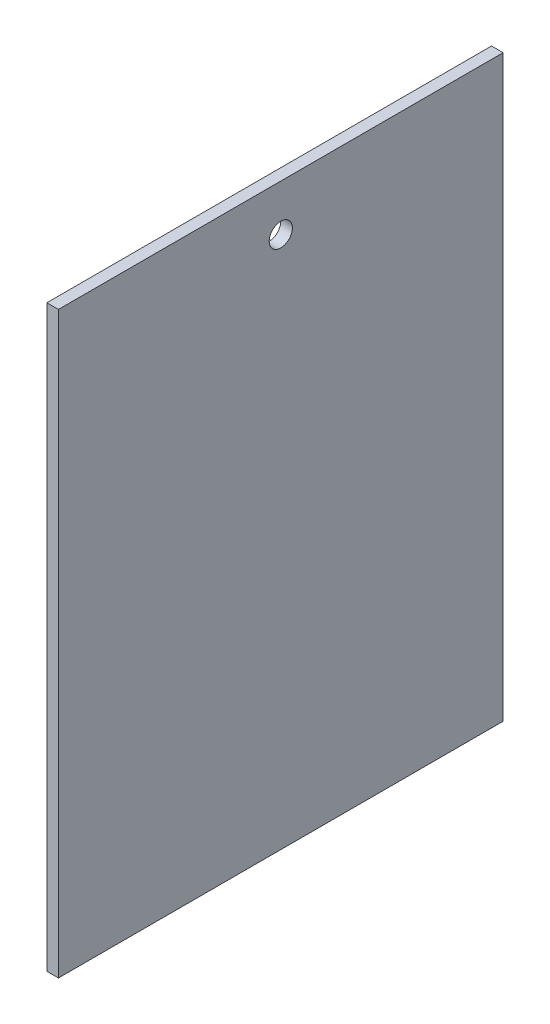
ISO-10303-21;
HEADER;
FILE_DESCRIPTION(('STEP AP214'),'2;1');
FILE_NAME('part.step','',(''),(''),'','','');
FILE_SCHEMA(('AUTOMOTIVE_DESIGN { 1 0 10303 214 1 1 1 1 }'));
ENDSEC;
DATA;
#1=APPLICATION_CONTEXT('core data for automotive mechanical design processes');
#2=APPLICATION_PROTOCOL_DEFINITION('international standard','automotive_design',2000,#1);
#3=PRODUCT_CONTEXT('',#1,'mechanical');
#4=PRODUCT('Part','Part','',(#3));
#5=PRODUCT_RELATED_PRODUCT_CATEGORY('part','',(#4));
#6=PRODUCT_DEFINITION_FORMATION('','',#4);
#7=PRODUCT_DEFINITION_CONTEXT('part definition',#1,'design');
#8=PRODUCT_DEFINITION('design','',#6,#7);
#9=PRODUCT_DEFINITION_SHAPE('','',#8);
#10=(LENGTH_UNIT() NAMED_UNIT(*) SI_UNIT(.MILLI.,.METRE.));
#11=(NAMED_UNIT(*) PLANE_ANGLE_UNIT() SI_UNIT($,.RADIAN.));
#12=(NAMED_UNIT(*) SI_UNIT($,.STERADIAN.) SOLID_ANGLE_UNIT());
#13=UNCERTAINTY_MEASURE_WITH_UNIT(LENGTH_MEASURE(1.E-05),#10,'distance_accuracy_value','');
#14=(GEOMETRIC_REPRESENTATION_CONTEXT(3) GLOBAL_UNCERTAINTY_ASSIGNED_CONTEXT((#13)) GLOBAL_UNIT_ASSIGNED_CONTEXT((#10,
#11,#12)) REPRESENTATION_CONTEXT('',''));
#15=CARTESIAN_POINT('',(0.,0.,0.));
#16=DIRECTION('',(0.,0.,1.));
#17=DIRECTION('',(1.,0.,0.));
#18=AXIS2_PLACEMENT_3D('',#15,#16,#17);
#19=CARTESIAN_POINT('',(5.,250.,-192.));
#20=DIRECTION('',(0.,0.,1.));
#21=DIRECTION('',(0.,-1.,0.));
#22=AXIS2_PLACEMENT_3D('',#19,#20,#21);
#23=PLANE('',#22);
#24=DIRECTION('',(0.,1.,0.));
#25=VECTOR('',#24,1.);
#26=CARTESIAN_POINT('',(-5.,250.,-192.));
#27=LINE('',#26,#25);
#28=CARTESIAN_POINT('',(-5.,-250.,-192.));
#29=VERTEX_POINT('',#28);
#30=CARTESIAN_POINT('',(-5.,250.,-192.));
#31=VERTEX_POINT('',#30);
#32=EDGE_CURVE('E98',#29,#31,#27,.T.);
#33=ORIENTED_EDGE('',*,*,#32,.T.);
#34=DIRECTION('',(-1.,0.,0.));
#35=VECTOR('',#34,1.);
#36=CARTESIAN_POINT('',(5.,250.,-192.));
#37=LINE('',#36,#35);
#38=CARTESIAN_POINT('',(5.,250.,-192.));
#39=VERTEX_POINT('',#38);
#40=EDGE_CURVE('E11',#39,#31,#37,.T.);
#41=ORIENTED_EDGE('',*,*,#40,.F.);
#42=DIRECTION('',(0.,1.,0.));
#43=VECTOR('',#42,1.);
#44=CARTESIAN_POINT('',(5.,250.,-192.));
#45=LINE('',#44,#43);
#46=CARTESIAN_POINT('',(5.,-250.,-192.));
#47=VERTEX_POINT('',#46);
#48=EDGE_CURVE('E86',#47,#39,#45,.T.);
#49=ORIENTED_EDGE('',*,*,#48,.F.);
#50=DIRECTION('',(-1.,0.,0.));
#51=VECTOR('',#50,1.);
#52=CARTESIAN_POINT('',(5.,-250.,-192.));
#53=LINE('',#52,#51);
#54=EDGE_CURVE('E94',#47,#29,#53,.T.);
#55=ORIENTED_EDGE('',*,*,#54,.T.);
#56=EDGE_LOOP('',(#33,#41,#49,#55));
#57=FACE_BOUND('',#56,.T.);
#58=ADVANCED_FACE('F35',(#57),#23,.F.);
#59=CARTESIAN_POINT('',(5.,250.,192.));
#60=DIRECTION('',(0.,-1.,0.));
#61=DIRECTION('',(0.,0.,-1.));
#62=AXIS2_PLACEMENT_3D('',#59,#60,#61);
#63=PLANE('',#62);
#64=DIRECTION('',(0.,0.,1.));
#65=VECTOR('',#64,1.);
#66=CARTESIAN_POINT('',(-5.,250.,192.));
#67=LINE('',#66,#65);
#68=CARTESIAN_POINT('',(-5.,250.,192.));
#69=VERTEX_POINT('',#68);
#70=EDGE_CURVE('E90',#31,#69,#67,.T.);
#71=ORIENTED_EDGE('',*,*,#70,.T.);
#72=DIRECTION('',(-1.,0.,0.));
#73=VECTOR('',#72,1.);
#74=CARTESIAN_POINT('',(5.,250.,192.));
#75=LINE('',#74,#73);
#76=CARTESIAN_POINT('',(5.,250.,192.));
#77=VERTEX_POINT('',#76);
#78=EDGE_CURVE('E43',#77,#69,#75,.T.);
#79=ORIENTED_EDGE('',*,*,#78,.F.);
#80=DIRECTION('',(0.,0.,1.));
#81=VECTOR('',#80,1.);
#82=CARTESIAN_POINT('',(5.,250.,192.));
#83=LINE('',#82,#81);
#84=EDGE_CURVE('E81',#39,#77,#83,.T.);
#85=ORIENTED_EDGE('',*,*,#84,.F.);
#86=ORIENTED_EDGE('',*,*,#40,.T.);
#87=EDGE_LOOP('',(#71,#79,#85,#86));
#88=FACE_BOUND('',#87,.T.);
#89=ADVANCED_FACE('F89',(#88),#63,.F.);
#90=CARTESIAN_POINT('',(5.,250.,192.));
#91=DIRECTION('',(0.,0.,-1.));
#92=DIRECTION('',(0.,1.,0.));
#93=AXIS2_PLACEMENT_3D('',#90,#91,#92);
#94=PLANE('',#93);
#95=DIRECTION('',(0.,-1.,0.));
#96=VECTOR('',#95,1.);
#97=CARTESIAN_POINT('',(-5.,250.,192.));
#98=LINE('',#97,#96);
#99=CARTESIAN_POINT('',(-5.,-250.,192.));
#100=VERTEX_POINT('',#99);
#101=EDGE_CURVE('E68',#69,#100,#98,.T.);
#102=ORIENTED_EDGE('',*,*,#101,.T.);
#103=DIRECTION('',(-1.,0.,0.));
#104=VECTOR('',#103,1.);
#105=CARTESIAN_POINT('',(5.,-250.,192.));
#106=LINE('',#105,#104);
#107=CARTESIAN_POINT('',(5.,-250.,192.));
#108=VERTEX_POINT('',#107);
#109=EDGE_CURVE('E91',#108,#100,#106,.T.);
#110=ORIENTED_EDGE('',*,*,#109,.F.);
#111=DIRECTION('',(0.,-1.,0.));
#112=VECTOR('',#111,1.);
#113=CARTESIAN_POINT('',(5.,250.,192.));
#114=LINE('',#113,#112);
#115=EDGE_CURVE('E84',#77,#108,#114,.T.);
#116=ORIENTED_EDGE('',*,*,#115,.F.);
#117=ORIENTED_EDGE('',*,*,#78,.T.);
#118=EDGE_LOOP('',(#102,#110,#116,#117));
#119=FACE_BOUND('',#118,.T.);
#120=ADVANCED_FACE('F92',(#119),#94,.F.);
#121=CARTESIAN_POINT('',(5.,-250.,192.));
#122=DIRECTION('',(0.,1.,0.));
#123=DIRECTION('',(0.,0.,1.));
#124=AXIS2_PLACEMENT_3D('',#121,#122,#123);
#125=PLANE('',#124);
#126=DIRECTION('',(0.,0.,-1.));
#127=VECTOR('',#126,1.);
#128=CARTESIAN_POINT('',(-5.,-250.,192.));
#129=LINE('',#128,#127);
#130=EDGE_CURVE('E74',#100,#29,#129,.T.);
#131=ORIENTED_EDGE('',*,*,#130,.T.);
#132=ORIENTED_EDGE('',*,*,#54,.F.);
#133=DIRECTION('',(0.,0.,-1.));
#134=VECTOR('',#133,1.);
#135=CARTESIAN_POINT('',(5.,-250.,192.));
#136=LINE('',#135,#134);
#137=EDGE_CURVE('E51',#108,#47,#136,.T.);
#138=ORIENTED_EDGE('',*,*,#137,.F.);
#139=ORIENTED_EDGE('',*,*,#109,.T.);
#140=EDGE_LOOP('',(#131,#132,#138,#139));
#141=FACE_BOUND('',#140,.T.);
#142=ADVANCED_FACE('F106',(#141),#125,.F.);
#143=CARTESIAN_POINT('',(5.,0.,0.));
#144=DIRECTION('',(1.,0.,0.));
#145=DIRECTION('',(0.,0.,-1.));
#146=AXIS2_PLACEMENT_3D('',#143,#144,#145);
#147=PLANE('',#146);
#148=CARTESIAN_POINT('',(5.,210.,0.));
#149=DIRECTION('',(1.,0.,0.));
#150=DIRECTION('',(0.,0.,-1.));
#151=AXIS2_PLACEMENT_3D('',#148,#149,#150);
#152=CIRCLE('',#151,10.);
#153=CARTESIAN_POINT('',(5.,210.,-10.));
#154=VERTEX_POINT('',#153);
#155=EDGE_CURVE('E112',#154,#154,#152,.T.);
#156=ORIENTED_EDGE('',*,*,#155,.F.);
#157=EDGE_LOOP('',(#156));
#158=FACE_BOUND('',#157,.T.);
#159=ORIENTED_EDGE('',*,*,#48,.T.);
#160=ORIENTED_EDGE('',*,*,#84,.T.);
#161=ORIENTED_EDGE('',*,*,#115,.T.);
#162=ORIENTED_EDGE('',*,*,#137,.T.);
#163=EDGE_LOOP('',(#159,#160,#161,#162));
#164=FACE_BOUND('',#163,.T.);
#165=ADVANCED_FACE('F82',(#158,#164),#147,.T.);
#166=CARTESIAN_POINT('',(-5.,0.,0.));
#167=DIRECTION('',(1.,0.,0.));
#168=DIRECTION('',(0.,0.,-1.));
#169=AXIS2_PLACEMENT_3D('',#166,#167,#168);
#170=PLANE('',#169);
#171=CARTESIAN_POINT('',(-5.,210.,0.));
#172=DIRECTION('',(1.,0.,0.));
#173=DIRECTION('',(0.,0.,-1.));
#174=AXIS2_PLACEMENT_3D('',#171,#172,#173);
#175=CIRCLE('',#174,10.);
#176=CARTESIAN_POINT('',(-5.,210.,-10.));
#177=VERTEX_POINT('',#176);
#178=EDGE_CURVE('E101',#177,#177,#175,.T.);
#179=ORIENTED_EDGE('',*,*,#178,.T.);
#180=EDGE_LOOP('',(#179));
#181=FACE_BOUND('',#180,.T.);
#182=ORIENTED_EDGE('',*,*,#32,.F.);
#183=ORIENTED_EDGE('',*,*,#130,.F.);
#184=ORIENTED_EDGE('',*,*,#101,.F.);
#185=ORIENTED_EDGE('',*,*,#70,.F.);
#186=EDGE_LOOP('',(#182,#183,#184,#185));
#187=FACE_BOUND('',#186,.T.);
#188=ADVANCED_FACE('F109',(#181,#187),#170,.F.);
#189=CARTESIAN_POINT('',(-5.,210.,0.));
#190=DIRECTION('',(1.,0.,0.));
#191=DIRECTION('',(0.,0.,-1.));
#192=AXIS2_PLACEMENT_3D('',#189,#190,#191);
#193=CYLINDRICAL_SURFACE('',#192,10.);
#194=ORIENTED_EDGE('',*,*,#178,.F.);
#195=EDGE_LOOP('',(#194));
#196=FACE_BOUND('',#195,.T.);
#197=ORIENTED_EDGE('',*,*,#155,.T.);
#198=EDGE_LOOP('',(#197));
#199=FACE_BOUND('',#198,.T.);
#200=ADVANCED_FACE('F119',(#196,#199),#193,.F.);
#201=CLOSED_SHELL('',(#58,#89,#120,#142,#165,#188,#200));
#202=MANIFOLD_SOLID_BREP('B2',#201);
#203=ADVANCED_BREP_SHAPE_REPRESENTATION('',(#18,#202),#14);
#204=SHAPE_DEFINITION_REPRESENTATION(#9,#203);
ENDSEC;
END-ISO-10303-21;
